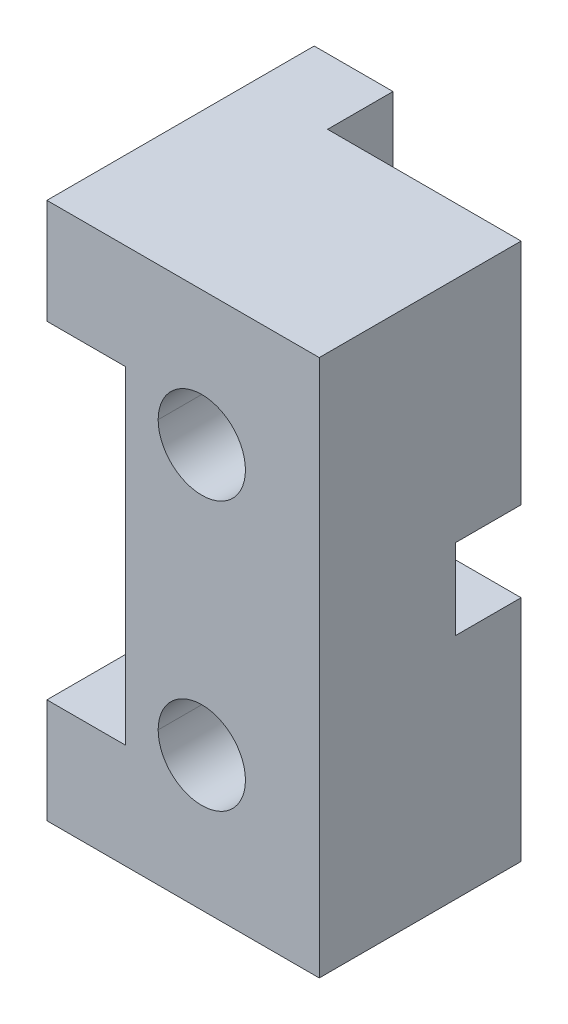
ISO-10303-21;
HEADER;
FILE_DESCRIPTION(('STEP AP214'),'2;1');
FILE_NAME('part.step','',(''),(''),'','','');
FILE_SCHEMA(('AUTOMOTIVE_DESIGN { 1 0 10303 214 1 1 1 1 }'));
ENDSEC;
DATA;
#1=APPLICATION_CONTEXT('core data for automotive mechanical design processes');
#2=APPLICATION_PROTOCOL_DEFINITION('international standard','automotive_design',2000,#1);
#3=PRODUCT_CONTEXT('',#1,'mechanical');
#4=PRODUCT('Part','Part','',(#3));
#5=PRODUCT_RELATED_PRODUCT_CATEGORY('part','',(#4));
#6=PRODUCT_DEFINITION_FORMATION('','',#4);
#7=PRODUCT_DEFINITION_CONTEXT('part definition',#1,'design');
#8=PRODUCT_DEFINITION('design','',#6,#7);
#9=PRODUCT_DEFINITION_SHAPE('','',#8);
#10=(LENGTH_UNIT() NAMED_UNIT(*) SI_UNIT(.MILLI.,.METRE.));
#11=(NAMED_UNIT(*) PLANE_ANGLE_UNIT() SI_UNIT($,.RADIAN.));
#12=(NAMED_UNIT(*) SI_UNIT($,.STERADIAN.) SOLID_ANGLE_UNIT());
#13=UNCERTAINTY_MEASURE_WITH_UNIT(LENGTH_MEASURE(1.E-05),#10,'distance_accuracy_value','');
#14=(GEOMETRIC_REPRESENTATION_CONTEXT(3) GLOBAL_UNCERTAINTY_ASSIGNED_CONTEXT((#13)) GLOBAL_UNIT_ASSIGNED_CONTEXT((#10,
#11,#12)) REPRESENTATION_CONTEXT('',''));
#15=CARTESIAN_POINT('',(0.,0.,0.));
#16=DIRECTION('',(0.,0.,1.));
#17=DIRECTION('',(1.,0.,0.));
#18=AXIS2_PLACEMENT_3D('',#15,#16,#17);
#19=CARTESIAN_POINT('',(14.319230782037,-3.38004715118205,7.4));
#20=DIRECTION('',(0.,0.,-1.));
#21=DIRECTION('',(-1.,0.,0.));
#22=AXIS2_PLACEMENT_3D('',#19,#20,#21);
#23=CYLINDRICAL_SURFACE('',#22,1.6);
#24=DIRECTION('',(0.,0.,-1.));
#25=VECTOR('',#24,1.);
#26=CARTESIAN_POINT('',(15.9192307820371,-3.38004715118205,7.4));
#27=LINE('',#26,#25);
#28=CARTESIAN_POINT('',(15.9192307820371,-3.38004715118205,7.4));
#29=VERTEX_POINT('',#28);
#30=CARTESIAN_POINT('',(15.9192307820371,-3.38004715118205,0.));
#31=VERTEX_POINT('',#30);
#32=EDGE_CURVE('E271',#29,#31,#27,.T.);
#33=ORIENTED_EDGE('',*,*,#32,.F.);
#34=CARTESIAN_POINT('',(14.319230782037,-3.38004715118205,7.4));
#35=DIRECTION('',(0.,0.,-1.));
#36=DIRECTION('',(1.,0.,0.));
#37=AXIS2_PLACEMENT_3D('',#34,#35,#36);
#38=CIRCLE('',#37,1.6);
#39=CARTESIAN_POINT('',(12.719230782037,-3.38004715118205,7.4));
#40=VERTEX_POINT('',#39);
#41=EDGE_CURVE('E278',#40,#29,#38,.T.);
#42=ORIENTED_EDGE('',*,*,#41,.F.);
#43=DIRECTION('',(0.,0.,-1.));
#44=VECTOR('',#43,1.);
#45=CARTESIAN_POINT('',(12.719230782037,-3.38004715118205,7.4));
#46=LINE('',#45,#44);
#47=CARTESIAN_POINT('',(12.719230782037,-3.38004715118205,0.));
#48=VERTEX_POINT('',#47);
#49=EDGE_CURVE('E349',#40,#48,#46,.T.);
#50=ORIENTED_EDGE('',*,*,#49,.T.);
#51=CARTESIAN_POINT('',(14.319230782037,-3.38004715118205,0.));
#52=DIRECTION('',(0.,0.,-1.));
#53=DIRECTION('',(1.,0.,0.));
#54=AXIS2_PLACEMENT_3D('',#51,#52,#53);
#55=CIRCLE('',#54,1.6);
#56=EDGE_CURVE('E337',#48,#31,#55,.T.);
#57=ORIENTED_EDGE('',*,*,#56,.T.);
#58=EDGE_LOOP('',(#33,#42,#50,#57));
#59=FACE_BOUND('',#58,.T.);
#60=ADVANCED_FACE('F15',(#59),#23,.F.);
#61=CARTESIAN_POINT('',(11.5303764001122,7.55495284835617,-2.4));
#62=DIRECTION('',(-1.,0.,0.));
#63=DIRECTION('',(0.,1.,0.));
#64=AXIS2_PLACEMENT_3D('',#61,#62,#63);
#65=PLANE('',#64);
#66=DIRECTION('',(0.,1.,0.));
#67=VECTOR('',#66,1.);
#68=CARTESIAN_POINT('',(11.5303764001122,7.55495284835617,0.));
#69=LINE('',#68,#67);
#70=CARTESIAN_POINT('',(11.5303764001122,7.55495284835616,0.));
#71=VERTEX_POINT('',#70);
#72=CARTESIAN_POINT('',(11.5303764001122,11.3949528483562,0.));
#73=VERTEX_POINT('',#72);
#74=EDGE_CURVE('E240',#71,#73,#69,.T.);
#75=ORIENTED_EDGE('',*,*,#74,.F.);
#76=DIRECTION('',(0.,0.,1.));
#77=VECTOR('',#76,1.);
#78=CARTESIAN_POINT('',(11.5303764001122,7.55495284835617,-2.4));
#79=LINE('',#78,#77);
#80=CARTESIAN_POINT('',(11.5303764001122,7.55495284835617,-2.4));
#81=VERTEX_POINT('',#80);
#82=EDGE_CURVE('E10',#81,#71,#79,.T.);
#83=ORIENTED_EDGE('',*,*,#82,.F.);
#84=DIRECTION('',(0.,1.,0.));
#85=VECTOR('',#84,1.);
#86=CARTESIAN_POINT('',(11.5303764001122,7.55495284835617,-2.4));
#87=LINE('',#86,#85);
#88=CARTESIAN_POINT('',(11.5303764001122,11.3949528483562,-2.4));
#89=VERTEX_POINT('',#88);
#90=EDGE_CURVE('E308',#81,#89,#87,.T.);
#91=ORIENTED_EDGE('',*,*,#90,.T.);
#92=DIRECTION('',(0.,0.,1.));
#93=VECTOR('',#92,1.);
#94=CARTESIAN_POINT('',(11.5303764001122,11.3949528483562,-2.4));
#95=LINE('',#94,#93);
#96=EDGE_CURVE('E275',#89,#73,#95,.T.);
#97=ORIENTED_EDGE('',*,*,#96,.T.);
#98=EDGE_LOOP('',(#75,#83,#91,#97));
#99=FACE_BOUND('',#98,.T.);
#100=ADVANCED_FACE('F711',(#99),#65,.F.);
#101=CARTESIAN_POINT('',(8.64037640011216,7.55495284835616,0.));
#102=DIRECTION('',(0.,1.,0.));
#103=DIRECTION('',(1.,0.,0.));
#104=AXIS2_PLACEMENT_3D('',#101,#102,#103);
#105=PLANE('',#104);
#106=DIRECTION('',(0.,0.,-1.));
#107=VECTOR('',#106,1.);
#108=CARTESIAN_POINT('',(11.5303764001122,7.55495284835617,0.));
#109=LINE('',#108,#107);
#110=CARTESIAN_POINT('',(11.5303764001122,7.55495284835617,7.4));
#111=VERTEX_POINT('',#110);
#112=EDGE_CURVE('E261',#111,#71,#109,.T.);
#113=ORIENTED_EDGE('',*,*,#112,.F.);
#114=DIRECTION('',(1.,0.,0.));
#115=VECTOR('',#114,1.);
#116=CARTESIAN_POINT('',(8.64037640011216,7.55495284835616,7.4));
#117=LINE('',#116,#115);
#118=CARTESIAN_POINT('',(8.64037640011216,7.55495284835616,7.4));
#119=VERTEX_POINT('',#118);
#120=EDGE_CURVE('E352',#119,#111,#117,.T.);
#121=ORIENTED_EDGE('',*,*,#120,.F.);
#122=DIRECTION('',(0.,0.,-1.));
#123=VECTOR('',#122,1.);
#124=CARTESIAN_POINT('',(8.64037640011216,7.55495284835616,0.));
#125=LINE('',#124,#123);
#126=CARTESIAN_POINT('',(8.64037640011216,7.55495284835616,-2.4));
#127=VERTEX_POINT('',#126);
#128=EDGE_CURVE('E26',#119,#127,#125,.T.);
#129=ORIENTED_EDGE('',*,*,#128,.T.);
#130=DIRECTION('',(1.,0.,0.));
#131=VECTOR('',#130,1.);
#132=CARTESIAN_POINT('',(8.64037640011216,7.55495284835616,-2.4));
#133=LINE('',#132,#131);
#134=EDGE_CURVE('E297',#127,#81,#133,.T.);
#135=ORIENTED_EDGE('',*,*,#134,.T.);
#136=ORIENTED_EDGE('',*,*,#82,.T.);
#137=EDGE_LOOP('',(#113,#121,#129,#135,#136));
#138=FACE_BOUND('',#137,.T.);
#139=ADVANCED_FACE('F705',(#138),#105,.F.);
#140=CARTESIAN_POINT('',(8.64037640011216,3.08990569671233,0.));
#141=DIRECTION('',(-1.,0.,0.));
#142=DIRECTION('',(0.,1.,0.));
#143=AXIS2_PLACEMENT_3D('',#140,#141,#142);
#144=PLANE('',#143);
#145=ORIENTED_EDGE('',*,*,#128,.F.);
#146=DIRECTION('',(0.,-1.,0.));
#147=VECTOR('',#146,1.);
#148=CARTESIAN_POINT('',(8.64037640011216,11.3949528483562,7.4));
#149=LINE('',#148,#147);
#150=CARTESIAN_POINT('',(8.64037640011216,11.3949528483562,7.4));
#151=VERTEX_POINT('',#150);
#152=EDGE_CURVE('E248',#151,#119,#149,.T.);
#153=ORIENTED_EDGE('',*,*,#152,.F.);
#154=DIRECTION('',(0.,0.,1.));
#155=VECTOR('',#154,1.);
#156=CARTESIAN_POINT('',(8.64037640011216,11.3949528483562,0.));
#157=LINE('',#156,#155);
#158=CARTESIAN_POINT('',(8.64037640011216,11.3949528483562,-2.4));
#159=VERTEX_POINT('',#158);
#160=EDGE_CURVE('E255',#159,#151,#157,.T.);
#161=ORIENTED_EDGE('',*,*,#160,.F.);
#162=DIRECTION('',(0.,-1.,0.));
#163=VECTOR('',#162,1.);
#164=CARTESIAN_POINT('',(8.64037640011216,11.3949528483562,-2.4));
#165=LINE('',#164,#163);
#166=EDGE_CURVE('E300',#159,#127,#165,.T.);
#167=ORIENTED_EDGE('',*,*,#166,.T.);
#168=EDGE_LOOP('',(#145,#153,#161,#167));
#169=FACE_BOUND('',#168,.T.);
#170=ADVANCED_FACE('F700',(#169),#144,.T.);
#171=CARTESIAN_POINT('',(0.,3.08990569671233,-2.4));
#172=DIRECTION('',(0.,0.,-1.));
#173=DIRECTION('',(0.,-1.,0.));
#174=AXIS2_PLACEMENT_3D('',#171,#172,#173);
#175=PLANE('',#174);
#176=ORIENTED_EDGE('',*,*,#134,.F.);
#177=ORIENTED_EDGE('',*,*,#166,.F.);
#178=DIRECTION('',(-1.,0.,0.));
#179=VECTOR('',#178,1.);
#180=CARTESIAN_POINT('',(11.5303764001122,11.3949528483562,-2.4));
#181=LINE('',#180,#179);
#182=EDGE_CURVE('E260',#89,#159,#181,.T.);
#183=ORIENTED_EDGE('',*,*,#182,.F.);
#184=ORIENTED_EDGE('',*,*,#90,.F.);
#185=EDGE_LOOP('',(#176,#177,#183,#184));
#186=FACE_BOUND('',#185,.T.);
#187=ADVANCED_FACE('F704',(#186),#175,.T.);
#188=CARTESIAN_POINT('',(0.,0.,-2.4));
#189=DIRECTION('',(0.,0.,-1.));
#190=DIRECTION('',(0.,-1.,0.));
#191=AXIS2_PLACEMENT_3D('',#188,#189,#190);
#192=PLANE('',#191);
#193=DIRECTION('',(1.,0.,0.));
#194=VECTOR('',#193,1.);
#195=CARTESIAN_POINT('',(8.64037640011216,-4.46504715164384,-2.4));
#196=LINE('',#195,#194);
#197=CARTESIAN_POINT('',(8.64037640011216,-4.46504715164384,-2.4));
#198=VERTEX_POINT('',#197);
#199=CARTESIAN_POINT('',(11.5303764001122,-4.46504715164384,-2.4));
#200=VERTEX_POINT('',#199);
#201=EDGE_CURVE('E186',#198,#200,#196,.T.);
#202=ORIENTED_EDGE('',*,*,#201,.T.);
#203=DIRECTION('',(0.,-1.,0.));
#204=VECTOR('',#203,1.);
#205=CARTESIAN_POINT('',(11.5303764001122,-4.46504715164384,-2.4));
#206=LINE('',#205,#204);
#207=CARTESIAN_POINT('',(11.5303764001122,-8.30504715164383,-2.4));
#208=VERTEX_POINT('',#207);
#209=EDGE_CURVE('E180',#200,#208,#206,.T.);
#210=ORIENTED_EDGE('',*,*,#209,.T.);
#211=DIRECTION('',(-1.,0.,0.));
#212=VECTOR('',#211,1.);
#213=CARTESIAN_POINT('',(11.5303764001122,-8.30504715164383,-2.4));
#214=LINE('',#213,#212);
#215=CARTESIAN_POINT('',(8.64037640011216,-8.30504715164383,-2.4));
#216=VERTEX_POINT('',#215);
#217=EDGE_CURVE('E239',#208,#216,#214,.T.);
#218=ORIENTED_EDGE('',*,*,#217,.T.);
#219=DIRECTION('',(0.,1.,0.));
#220=VECTOR('',#219,1.);
#221=CARTESIAN_POINT('',(8.64037640011216,-8.30504715164383,-2.4));
#222=LINE('',#221,#220);
#223=EDGE_CURVE('E279',#216,#198,#222,.T.);
#224=ORIENTED_EDGE('',*,*,#223,.T.);
#225=EDGE_LOOP('',(#202,#210,#218,#224));
#226=FACE_BOUND('',#225,.T.);
#227=ADVANCED_FACE('F793',(#226),#192,.T.);
#228=CARTESIAN_POINT('',(11.5303764001122,-4.46504715164384,-2.4));
#229=DIRECTION('',(-1.,0.,0.));
#230=DIRECTION('',(0.,0.,1.));
#231=AXIS2_PLACEMENT_3D('',#228,#229,#230);
#232=PLANE('',#231);
#233=DIRECTION('',(0.,-1.,0.));
#234=VECTOR('',#233,1.);
#235=CARTESIAN_POINT('',(11.5303764001122,-4.46504715164384,0.));
#236=LINE('',#235,#234);
#237=CARTESIAN_POINT('',(11.5303764001122,-4.46504715164384,0.));
#238=VERTEX_POINT('',#237);
#239=CARTESIAN_POINT('',(11.5303764001122,-8.30504715164383,0.));
#240=VERTEX_POINT('',#239);
#241=EDGE_CURVE('E178',#238,#240,#236,.T.);
#242=ORIENTED_EDGE('',*,*,#241,.T.);
#243=DIRECTION('',(0.,0.,1.));
#244=VECTOR('',#243,1.);
#245=CARTESIAN_POINT('',(11.5303764001122,-8.30504715164383,-2.4));
#246=LINE('',#245,#244);
#247=EDGE_CURVE('E19',#208,#240,#246,.T.);
#248=ORIENTED_EDGE('',*,*,#247,.F.);
#249=ORIENTED_EDGE('',*,*,#209,.F.);
#250=DIRECTION('',(0.,0.,1.));
#251=VECTOR('',#250,1.);
#252=CARTESIAN_POINT('',(11.5303764001122,-4.46504715164384,-2.4));
#253=LINE('',#252,#251);
#254=EDGE_CURVE('E174',#200,#238,#253,.T.);
#255=ORIENTED_EDGE('',*,*,#254,.T.);
#256=EDGE_LOOP('',(#242,#248,#249,#255));
#257=FACE_BOUND('',#256,.T.);
#258=ADVANCED_FACE('F176',(#257),#232,.F.);
#259=CARTESIAN_POINT('',(8.64037640011216,0.,0.));
#260=DIRECTION('',(-1.,0.,0.));
#261=DIRECTION('',(0.,0.,1.));
#262=AXIS2_PLACEMENT_3D('',#259,#260,#261);
#263=PLANE('',#262);
#264=DIRECTION('',(0.,0.,-1.));
#265=VECTOR('',#264,1.);
#266=CARTESIAN_POINT('',(8.64037640011216,-4.46504715164384,0.));
#267=LINE('',#266,#265);
#268=CARTESIAN_POINT('',(8.64037640011216,-4.46504715164384,7.4));
#269=VERTEX_POINT('',#268);
#270=EDGE_CURVE('E282',#269,#198,#267,.T.);
#271=ORIENTED_EDGE('',*,*,#270,.T.);
#272=ORIENTED_EDGE('',*,*,#223,.F.);
#273=DIRECTION('',(0.,0.,1.));
#274=VECTOR('',#273,1.);
#275=CARTESIAN_POINT('',(8.64037640011216,-8.30504715164383,0.));
#276=LINE('',#275,#274);
#277=CARTESIAN_POINT('',(8.64037640011216,-8.30504715164383,7.4));
#278=VERTEX_POINT('',#277);
#279=EDGE_CURVE('E231',#216,#278,#276,.T.);
#280=ORIENTED_EDGE('',*,*,#279,.T.);
#281=DIRECTION('',(0.,1.,0.));
#282=VECTOR('',#281,1.);
#283=CARTESIAN_POINT('',(8.64037640011216,-8.30504715164383,7.4));
#284=LINE('',#283,#282);
#285=EDGE_CURVE('E331',#278,#269,#284,.T.);
#286=ORIENTED_EDGE('',*,*,#285,.T.);
#287=EDGE_LOOP('',(#271,#272,#280,#286));
#288=FACE_BOUND('',#287,.T.);
#289=ADVANCED_FACE('F802',(#288),#263,.T.);
#290=CARTESIAN_POINT('',(8.64037640011216,-4.46504715164384,0.));
#291=DIRECTION('',(0.,-1.,0.));
#292=DIRECTION('',(0.,0.,-1.));
#293=AXIS2_PLACEMENT_3D('',#290,#291,#292);
#294=PLANE('',#293);
#295=DIRECTION('',(0.,0.,-1.));
#296=VECTOR('',#295,1.);
#297=CARTESIAN_POINT('',(11.5303764001122,-4.46504715164384,0.));
#298=LINE('',#297,#296);
#299=CARTESIAN_POINT('',(11.5303764001122,-4.46504715164384,7.4));
#300=VERTEX_POINT('',#299);
#301=EDGE_CURVE('E202',#300,#238,#298,.T.);
#302=ORIENTED_EDGE('',*,*,#301,.T.);
#303=ORIENTED_EDGE('',*,*,#254,.F.);
#304=ORIENTED_EDGE('',*,*,#201,.F.);
#305=ORIENTED_EDGE('',*,*,#270,.F.);
#306=DIRECTION('',(1.,0.,0.));
#307=VECTOR('',#306,1.);
#308=CARTESIAN_POINT('',(8.64037640011216,-4.46504715164384,7.4));
#309=LINE('',#308,#307);
#310=EDGE_CURVE('E207',#269,#300,#309,.T.);
#311=ORIENTED_EDGE('',*,*,#310,.T.);
#312=EDGE_LOOP('',(#302,#303,#304,#305,#311));
#313=FACE_BOUND('',#312,.T.);
#314=ADVANCED_FACE('F205',(#313),#294,.F.);
#315=CARTESIAN_POINT('',(0.,0.,2.4));
#316=DIRECTION('',(0.,0.,-1.));
#317=DIRECTION('',(0.,-1.,0.));
#318=AXIS2_PLACEMENT_3D('',#315,#316,#317);
#319=PLANE('',#318);
#320=DIRECTION('',(-1.,0.,0.));
#321=VECTOR('',#320,1.);
#322=CARTESIAN_POINT('',(11.5303764001122,3.01995284835616,2.4));
#323=LINE('',#322,#321);
#324=CARTESIAN_POINT('',(18.6259170702371,3.01995284835616,2.4));
#325=VERTEX_POINT('',#324);
#326=CARTESIAN_POINT('',(11.5303764001122,3.01995284835616,2.4));
#327=VERTEX_POINT('',#326);
#328=EDGE_CURVE('E283',#325,#327,#323,.T.);
#329=ORIENTED_EDGE('',*,*,#328,.F.);
#330=DIRECTION('',(0.,1.,0.));
#331=VECTOR('',#330,1.);
#332=CARTESIAN_POINT('',(18.6259170702371,3.01995284835616,2.4));
#333=LINE('',#332,#331);
#334=CARTESIAN_POINT('',(18.6259170702371,0.069952848356166,2.4));
#335=VERTEX_POINT('',#334);
#336=EDGE_CURVE('E187',#335,#325,#333,.T.);
#337=ORIENTED_EDGE('',*,*,#336,.F.);
#338=DIRECTION('',(1.,0.,0.));
#339=VECTOR('',#338,1.);
#340=CARTESIAN_POINT('',(18.6259170702371,0.069952848356166,2.4));
#341=LINE('',#340,#339);
#342=CARTESIAN_POINT('',(11.5303764001122,0.0699528483561656,2.4));
#343=VERTEX_POINT('',#342);
#344=EDGE_CURVE('E249',#343,#335,#341,.T.);
#345=ORIENTED_EDGE('',*,*,#344,.F.);
#346=DIRECTION('',(0.,-1.,0.));
#347=VECTOR('',#346,1.);
#348=CARTESIAN_POINT('',(11.5303764001122,0.0699528483561656,2.4));
#349=LINE('',#348,#347);
#350=EDGE_CURVE('E222',#327,#343,#349,.T.);
#351=ORIENTED_EDGE('',*,*,#350,.F.);
#352=EDGE_LOOP('',(#329,#337,#345,#351));
#353=FACE_BOUND('',#352,.T.);
#354=ADVANCED_FACE('F17',(#353),#319,.T.);
#355=CARTESIAN_POINT('',(18.6259170702371,0.,7.4));
#356=DIRECTION('',(1.,0.,0.));
#357=DIRECTION('',(0.,1.,0.));
#358=AXIS2_PLACEMENT_3D('',#355,#356,#357);
#359=PLANE('',#358);
#360=DIRECTION('',(0.,-1.,0.));
#361=VECTOR('',#360,1.);
#362=CARTESIAN_POINT('',(18.6259170702371,0.,0.));
#363=LINE('',#362,#361);
#364=CARTESIAN_POINT('',(18.6259170702371,0.069952848356166,0.));
#365=VERTEX_POINT('',#364);
#366=CARTESIAN_POINT('',(18.6259170702371,-8.30504715164383,0.));
#367=VERTEX_POINT('',#366);
#368=EDGE_CURVE('E233',#365,#367,#363,.T.);
#369=ORIENTED_EDGE('',*,*,#368,.F.);
#370=DIRECTION('',(0.,0.,-1.));
#371=VECTOR('',#370,1.);
#372=CARTESIAN_POINT('',(18.6259170702371,0.069952848356166,7.4));
#373=LINE('',#372,#371);
#374=EDGE_CURVE('E252',#335,#365,#373,.T.);
#375=ORIENTED_EDGE('',*,*,#374,.F.);
#376=ORIENTED_EDGE('',*,*,#336,.T.);
#377=DIRECTION('',(0.,0.,-1.));
#378=VECTOR('',#377,1.);
#379=CARTESIAN_POINT('',(18.6259170702371,3.01995284835616,7.4));
#380=LINE('',#379,#378);
#381=CARTESIAN_POINT('',(18.6259170702371,3.01995284835616,0.));
#382=VERTEX_POINT('',#381);
#383=EDGE_CURVE('E286',#325,#382,#380,.T.);
#384=ORIENTED_EDGE('',*,*,#383,.T.);
#385=DIRECTION('',(0.,-1.,0.));
#386=VECTOR('',#385,1.);
#387=CARTESIAN_POINT('',(18.6259170702371,0.,0.));
#388=LINE('',#387,#386);
#389=CARTESIAN_POINT('',(18.6259170702371,11.3949528483562,0.));
#390=VERTEX_POINT('',#389);
#391=EDGE_CURVE('E243',#390,#382,#388,.T.);
#392=ORIENTED_EDGE('',*,*,#391,.F.);
#393=DIRECTION('',(0.,0.,-1.));
#394=VECTOR('',#393,1.);
#395=CARTESIAN_POINT('',(18.6259170702371,11.3949528483562,7.4));
#396=LINE('',#395,#394);
#397=CARTESIAN_POINT('',(18.6259170702371,11.3949528483562,7.4));
#398=VERTEX_POINT('',#397);
#399=EDGE_CURVE('E357',#398,#390,#396,.T.);
#400=ORIENTED_EDGE('',*,*,#399,.F.);
#401=DIRECTION('',(0.,-1.,0.));
#402=VECTOR('',#401,1.);
#403=CARTESIAN_POINT('',(18.6259170702371,0.,7.4));
#404=LINE('',#403,#402);
#405=CARTESIAN_POINT('',(18.6259170702371,-8.30504715164383,7.4));
#406=VERTEX_POINT('',#405);
#407=EDGE_CURVE('E245',#398,#406,#404,.T.);
#408=ORIENTED_EDGE('',*,*,#407,.T.);
#409=DIRECTION('',(0.,0.,-1.));
#410=VECTOR('',#409,1.);
#411=CARTESIAN_POINT('',(18.6259170702371,-8.30504715164383,7.4));
#412=LINE('',#411,#410);
#413=EDGE_CURVE('E232',#406,#367,#412,.T.);
#414=ORIENTED_EDGE('',*,*,#413,.T.);
#415=EDGE_LOOP('',(#369,#375,#376,#384,#392,#400,#408,#414));
#416=FACE_BOUND('',#415,.T.);
#417=ADVANCED_FACE('F415',(#416),#359,.T.);
#418=CARTESIAN_POINT('',(14.319230782037,6.46995284789439,7.4));
#419=DIRECTION('',(0.,0.,-1.));
#420=DIRECTION('',(-1.,0.,0.));
#421=AXIS2_PLACEMENT_3D('',#418,#419,#420);
#422=CYLINDRICAL_SURFACE('',#421,1.6);
#423=DIRECTION('',(0.,0.,-1.));
#424=VECTOR('',#423,1.);
#425=CARTESIAN_POINT('',(15.9192307820371,6.46995284789439,7.4));
#426=LINE('',#425,#424);
#427=CARTESIAN_POINT('',(15.9192307820371,6.46995284789439,7.4));
#428=VERTEX_POINT('',#427);
#429=CARTESIAN_POINT('',(15.9192307820371,6.46995284789439,0.));
#430=VERTEX_POINT('',#429);
#431=EDGE_CURVE('E294',#428,#430,#426,.T.);
#432=ORIENTED_EDGE('',*,*,#431,.F.);
#433=CARTESIAN_POINT('',(14.319230782037,6.46995284789439,7.4));
#434=DIRECTION('',(0.,0.,1.));
#435=DIRECTION('',(1.,0.,0.));
#436=AXIS2_PLACEMENT_3D('',#433,#434,#435);
#437=CIRCLE('',#436,1.6);
#438=CARTESIAN_POINT('',(12.719230782037,6.46995284789439,7.4));
#439=VERTEX_POINT('',#438);
#440=EDGE_CURVE('E244',#428,#439,#437,.T.);
#441=ORIENTED_EDGE('',*,*,#440,.T.);
#442=DIRECTION('',(0.,0.,-1.));
#443=VECTOR('',#442,1.);
#444=CARTESIAN_POINT('',(12.719230782037,6.46995284789439,7.4));
#445=LINE('',#444,#443);
#446=CARTESIAN_POINT('',(12.719230782037,6.46995284789439,0.));
#447=VERTEX_POINT('',#446);
#448=EDGE_CURVE('E293',#439,#447,#445,.T.);
#449=ORIENTED_EDGE('',*,*,#448,.T.);
#450=CARTESIAN_POINT('',(14.319230782037,6.46995284789439,0.));
#451=DIRECTION('',(0.,0.,1.));
#452=DIRECTION('',(1.,0.,0.));
#453=AXIS2_PLACEMENT_3D('',#450,#451,#452);
#454=CIRCLE('',#453,1.6);
#455=EDGE_CURVE('E253',#430,#447,#454,.T.);
#456=ORIENTED_EDGE('',*,*,#455,.F.);
#457=EDGE_LOOP('',(#432,#441,#449,#456));
#458=FACE_BOUND('',#457,.T.);
#459=ADVANCED_FACE('F372',(#458),#422,.F.);
#460=CARTESIAN_POINT('',(0.,3.01995284835616,7.4));
#461=DIRECTION('',(0.,-1.,0.));
#462=DIRECTION('',(0.,0.,-1.));
#463=AXIS2_PLACEMENT_3D('',#460,#461,#462);
#464=PLANE('',#463);
#465=ORIENTED_EDGE('',*,*,#328,.T.);
#466=DIRECTION('',(0.,0.,-1.));
#467=VECTOR('',#466,1.);
#468=CARTESIAN_POINT('',(11.5303764001122,3.01995284835616,7.4));
#469=LINE('',#468,#467);
#470=CARTESIAN_POINT('',(11.5303764001122,3.01995284835616,0.));
#471=VERTEX_POINT('',#470);
#472=EDGE_CURVE('E307',#327,#471,#469,.T.);
#473=ORIENTED_EDGE('',*,*,#472,.T.);
#474=DIRECTION('',(-1.,0.,0.));
#475=VECTOR('',#474,1.);
#476=CARTESIAN_POINT('',(0.,3.01995284835616,0.));
#477=LINE('',#476,#475);
#478=EDGE_CURVE('E226',#382,#471,#477,.T.);
#479=ORIENTED_EDGE('',*,*,#478,.F.);
#480=ORIENTED_EDGE('',*,*,#383,.F.);
#481=EDGE_LOOP('',(#465,#473,#479,#480));
#482=FACE_BOUND('',#481,.T.);
#483=ADVANCED_FACE('F455',(#482),#464,.T.);
#484=CARTESIAN_POINT('',(0.,0.0699528483561642,7.4));
#485=DIRECTION('',(0.,1.,0.));
#486=DIRECTION('',(1.,0.,0.));
#487=AXIS2_PLACEMENT_3D('',#484,#485,#486);
#488=PLANE('',#487);
#489=ORIENTED_EDGE('',*,*,#344,.T.);
#490=ORIENTED_EDGE('',*,*,#374,.T.);
#491=DIRECTION('',(1.,0.,0.));
#492=VECTOR('',#491,1.);
#493=CARTESIAN_POINT('',(0.,0.0699528483561642,0.));
#494=LINE('',#493,#492);
#495=CARTESIAN_POINT('',(11.5303764001122,0.0699528483561656,0.));
#496=VERTEX_POINT('',#495);
#497=EDGE_CURVE('E201',#496,#365,#494,.T.);
#498=ORIENTED_EDGE('',*,*,#497,.F.);
#499=DIRECTION('',(0.,0.,-1.));
#500=VECTOR('',#499,1.);
#501=CARTESIAN_POINT('',(11.5303764001122,0.0699528483561656,7.4));
#502=LINE('',#501,#500);
#503=EDGE_CURVE('E216',#343,#496,#502,.T.);
#504=ORIENTED_EDGE('',*,*,#503,.F.);
#505=EDGE_LOOP('',(#489,#490,#498,#504));
#506=FACE_BOUND('',#505,.T.);
#507=ADVANCED_FACE('F727',(#506),#488,.T.);
#508=CARTESIAN_POINT('',(0.,0.,0.));
#509=DIRECTION('',(0.,0.,1.));
#510=DIRECTION('',(1.,0.,0.));
#511=AXIS2_PLACEMENT_3D('',#508,#509,#510);
#512=PLANE('',#511);
#513=CARTESIAN_POINT('',(14.319230782037,6.46995284789439,0.));
#514=DIRECTION('',(0.,0.,1.));
#515=DIRECTION('',(1.,0.,0.));
#516=AXIS2_PLACEMENT_3D('',#513,#514,#515);
#517=CIRCLE('',#516,1.6);
#518=EDGE_CURVE('E289',#447,#430,#517,.T.);
#519=ORIENTED_EDGE('',*,*,#518,.T.);
#520=ORIENTED_EDGE('',*,*,#455,.T.);
#521=EDGE_LOOP('',(#519,#520));
#522=FACE_BOUND('',#521,.T.);
#523=ORIENTED_EDGE('',*,*,#74,.T.);
#524=DIRECTION('',(-1.,0.,0.));
#525=VECTOR('',#524,1.);
#526=CARTESIAN_POINT('',(0.,11.3949528483562,0.));
#527=LINE('',#526,#525);
#528=EDGE_CURVE('E341',#390,#73,#527,.T.);
#529=ORIENTED_EDGE('',*,*,#528,.F.);
#530=ORIENTED_EDGE('',*,*,#391,.T.);
#531=ORIENTED_EDGE('',*,*,#478,.T.);
#532=DIRECTION('',(0.,-1.,0.));
#533=VECTOR('',#532,1.);
#534=CARTESIAN_POINT('',(11.5303764001122,0.,0.));
#535=LINE('',#534,#533);
#536=EDGE_CURVE('E265',#71,#471,#535,.T.);
#537=ORIENTED_EDGE('',*,*,#536,.F.);
#538=EDGE_LOOP('',(#523,#529,#530,#531,#537));
#539=FACE_BOUND('',#538,.T.);
#540=ADVANCED_FACE('F405',(#522,#539),#512,.F.);
#541=CARTESIAN_POINT('',(0.,0.,7.4));
#542=DIRECTION('',(0.,0.,1.));
#543=DIRECTION('',(1.,0.,0.));
#544=AXIS2_PLACEMENT_3D('',#541,#542,#543);
#545=PLANE('',#544);
#546=CARTESIAN_POINT('',(14.319230782037,6.46995284789439,7.4));
#547=DIRECTION('',(0.,0.,1.));
#548=DIRECTION('',(1.,0.,0.));
#549=AXIS2_PLACEMENT_3D('',#546,#547,#548);
#550=CIRCLE('',#549,1.6);
#551=EDGE_CURVE('E345',#439,#428,#550,.T.);
#552=ORIENTED_EDGE('',*,*,#551,.F.);
#553=ORIENTED_EDGE('',*,*,#440,.F.);
#554=EDGE_LOOP('',(#552,#553));
#555=FACE_BOUND('',#554,.T.);
#556=ORIENTED_EDGE('',*,*,#41,.T.);
#557=CARTESIAN_POINT('',(14.319230782037,-3.38004715118205,7.4));
#558=DIRECTION('',(0.,0.,-1.));
#559=DIRECTION('',(1.,0.,0.));
#560=AXIS2_PLACEMENT_3D('',#557,#558,#559);
#561=CIRCLE('',#560,1.6);
#562=EDGE_CURVE('E267',#29,#40,#561,.T.);
#563=ORIENTED_EDGE('',*,*,#562,.T.);
#564=EDGE_LOOP('',(#556,#563));
#565=FACE_BOUND('',#564,.T.);
#566=DIRECTION('',(1.,0.,0.));
#567=VECTOR('',#566,1.);
#568=CARTESIAN_POINT('',(0.,-8.30504715164383,7.4));
#569=LINE('',#568,#567);
#570=EDGE_CURVE('E227',#278,#406,#569,.T.);
#571=ORIENTED_EDGE('',*,*,#570,.T.);
#572=ORIENTED_EDGE('',*,*,#407,.F.);
#573=DIRECTION('',(-1.,0.,0.));
#574=VECTOR('',#573,1.);
#575=CARTESIAN_POINT('',(0.,11.3949528483562,7.4));
#576=LINE('',#575,#574);
#577=EDGE_CURVE('E259',#398,#151,#576,.T.);
#578=ORIENTED_EDGE('',*,*,#577,.T.);
#579=ORIENTED_EDGE('',*,*,#152,.T.);
#580=ORIENTED_EDGE('',*,*,#120,.T.);
#581=DIRECTION('',(0.,-1.,0.));
#582=VECTOR('',#581,1.);
#583=CARTESIAN_POINT('',(11.5303764001122,0.,7.4));
#584=LINE('',#583,#582);
#585=EDGE_CURVE('E266',#111,#300,#584,.T.);
#586=ORIENTED_EDGE('',*,*,#585,.T.);
#587=ORIENTED_EDGE('',*,*,#310,.F.);
#588=ORIENTED_EDGE('',*,*,#285,.F.);
#589=EDGE_LOOP('',(#571,#572,#578,#579,#580,#586,#587,#588));
#590=FACE_BOUND('',#589,.T.);
#591=ADVANCED_FACE('F401',(#555,#565,#590),#545,.T.);
#592=CARTESIAN_POINT('',(0.,-8.30504715164383,7.4));
#593=DIRECTION('',(0.,1.,0.));
#594=DIRECTION('',(1.,0.,0.));
#595=AXIS2_PLACEMENT_3D('',#592,#593,#594);
#596=PLANE('',#595);
#597=ORIENTED_EDGE('',*,*,#247,.T.);
#598=DIRECTION('',(1.,0.,0.));
#599=VECTOR('',#598,1.);
#600=CARTESIAN_POINT('',(0.,-8.30504715164383,0.));
#601=LINE('',#600,#599);
#602=EDGE_CURVE('E199',#240,#367,#601,.T.);
#603=ORIENTED_EDGE('',*,*,#602,.T.);
#604=ORIENTED_EDGE('',*,*,#413,.F.);
#605=ORIENTED_EDGE('',*,*,#570,.F.);
#606=ORIENTED_EDGE('',*,*,#279,.F.);
#607=ORIENTED_EDGE('',*,*,#217,.F.);
#608=EDGE_LOOP('',(#597,#603,#604,#605,#606,#607));
#609=FACE_BOUND('',#608,.T.);
#610=ADVANCED_FACE('F404',(#609),#596,.F.);
#611=CARTESIAN_POINT('',(0.,11.3949528483562,7.4));
#612=DIRECTION('',(0.,-1.,0.));
#613=DIRECTION('',(0.,0.,-1.));
#614=AXIS2_PLACEMENT_3D('',#611,#612,#613);
#615=PLANE('',#614);
#616=ORIENTED_EDGE('',*,*,#528,.T.);
#617=ORIENTED_EDGE('',*,*,#96,.F.);
#618=ORIENTED_EDGE('',*,*,#182,.T.);
#619=ORIENTED_EDGE('',*,*,#160,.T.);
#620=ORIENTED_EDGE('',*,*,#577,.F.);
#621=ORIENTED_EDGE('',*,*,#399,.T.);
#622=EDGE_LOOP('',(#616,#617,#618,#619,#620,#621));
#623=FACE_BOUND('',#622,.T.);
#624=ADVANCED_FACE('F422',(#623),#615,.F.);
#625=CARTESIAN_POINT('',(0.,0.,0.));
#626=DIRECTION('',(0.,0.,1.));
#627=DIRECTION('',(1.,0.,0.));
#628=AXIS2_PLACEMENT_3D('',#625,#626,#627);
#629=PLANE('',#628);
#630=ORIENTED_EDGE('',*,*,#56,.F.);
#631=CARTESIAN_POINT('',(14.319230782037,-3.38004715118205,0.));
#632=DIRECTION('',(0.,0.,-1.));
#633=DIRECTION('',(1.,0.,0.));
#634=AXIS2_PLACEMENT_3D('',#631,#632,#633);
#635=CIRCLE('',#634,1.6);
#636=EDGE_CURVE('E353',#31,#48,#635,.T.);
#637=ORIENTED_EDGE('',*,*,#636,.F.);
#638=EDGE_LOOP('',(#630,#637));
#639=FACE_BOUND('',#638,.T.);
#640=ORIENTED_EDGE('',*,*,#241,.F.);
#641=DIRECTION('',(0.,-1.,0.));
#642=VECTOR('',#641,1.);
#643=CARTESIAN_POINT('',(11.5303764001122,0.,0.));
#644=LINE('',#643,#642);
#645=EDGE_CURVE('E195',#496,#238,#644,.T.);
#646=ORIENTED_EDGE('',*,*,#645,.F.);
#647=ORIENTED_EDGE('',*,*,#497,.T.);
#648=ORIENTED_EDGE('',*,*,#368,.T.);
#649=ORIENTED_EDGE('',*,*,#602,.F.);
#650=EDGE_LOOP('',(#640,#646,#647,#648,#649));
#651=FACE_BOUND('',#650,.T.);
#652=ADVANCED_FACE('F192',(#639,#651),#629,.F.);
#653=CARTESIAN_POINT('',(11.5303764001122,0.,-1.2E-05));
#654=DIRECTION('',(-1.,0.,0.));
#655=DIRECTION('',(0.,0.,1.));
#656=AXIS2_PLACEMENT_3D('',#653,#654,#655);
#657=PLANE('',#656);
#658=ORIENTED_EDGE('',*,*,#585,.F.);
#659=ORIENTED_EDGE('',*,*,#112,.T.);
#660=ORIENTED_EDGE('',*,*,#536,.T.);
#661=ORIENTED_EDGE('',*,*,#472,.F.);
#662=ORIENTED_EDGE('',*,*,#350,.T.);
#663=ORIENTED_EDGE('',*,*,#503,.T.);
#664=ORIENTED_EDGE('',*,*,#645,.T.);
#665=ORIENTED_EDGE('',*,*,#301,.F.);
#666=EDGE_LOOP('',(#658,#659,#660,#661,#662,#663,#664,#665));
#667=FACE_BOUND('',#666,.T.);
#668=ADVANCED_FACE('F213',(#667),#657,.T.);
#669=CARTESIAN_POINT('',(14.319230782037,6.46995284789439,7.4));
#670=DIRECTION('',(0.,0.,-1.));
#671=DIRECTION('',(-1.,0.,0.));
#672=AXIS2_PLACEMENT_3D('',#669,#670,#671);
#673=CYLINDRICAL_SURFACE('',#672,1.6);
#674=ORIENTED_EDGE('',*,*,#551,.T.);
#675=ORIENTED_EDGE('',*,*,#431,.T.);
#676=ORIENTED_EDGE('',*,*,#518,.F.);
#677=ORIENTED_EDGE('',*,*,#448,.F.);
#678=EDGE_LOOP('',(#674,#675,#676,#677));
#679=FACE_BOUND('',#678,.T.);
#680=ADVANCED_FACE('F368',(#679),#673,.F.);
#681=CARTESIAN_POINT('',(14.319230782037,-3.38004715118205,7.4));
#682=DIRECTION('',(0.,0.,-1.));
#683=DIRECTION('',(-1.,0.,0.));
#684=AXIS2_PLACEMENT_3D('',#681,#682,#683);
#685=CYLINDRICAL_SURFACE('',#684,1.6);
#686=ORIENTED_EDGE('',*,*,#562,.F.);
#687=ORIENTED_EDGE('',*,*,#32,.T.);
#688=ORIENTED_EDGE('',*,*,#636,.T.);
#689=ORIENTED_EDGE('',*,*,#49,.F.);
#690=EDGE_LOOP('',(#686,#687,#688,#689));
#691=FACE_BOUND('',#690,.T.);
#692=ADVANCED_FACE('F397',(#691),#685,.F.);
#693=CLOSED_SHELL('',(#60,#100,#139,#170,#187,#227,#258,#289,#314,#354,#417,#459,#483,#507,#540,
#591,#610,#624,#652,#668,#680,#692));
#694=MANIFOLD_SOLID_BREP('B1',#693);
#695=ADVANCED_BREP_SHAPE_REPRESENTATION('',(#18,#694),#14);
#696=SHAPE_DEFINITION_REPRESENTATION(#9,#695);
ENDSEC;
END-ISO-10303-21;
